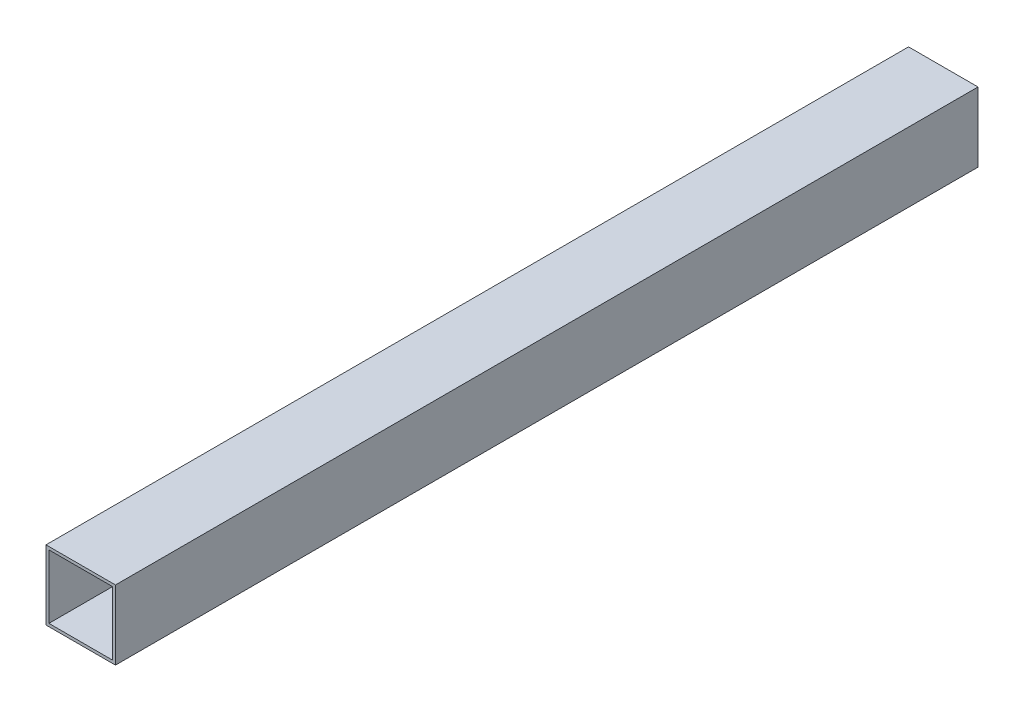
ISO-10303-21;
HEADER;
FILE_DESCRIPTION(('STEP AP214'),'2;1');
FILE_NAME('part.step','',(''),(''),'','','');
FILE_SCHEMA(('AUTOMOTIVE_DESIGN { 1 0 10303 214 1 1 1 1 }'));
ENDSEC;
DATA;
#1=APPLICATION_CONTEXT('core data for automotive mechanical design processes');
#2=APPLICATION_PROTOCOL_DEFINITION('international standard','automotive_design',2000,#1);
#3=PRODUCT_CONTEXT('',#1,'mechanical');
#4=PRODUCT('Part','Part','',(#3));
#5=PRODUCT_RELATED_PRODUCT_CATEGORY('part','',(#4));
#6=PRODUCT_DEFINITION_FORMATION('','',#4);
#7=PRODUCT_DEFINITION_CONTEXT('part definition',#1,'design');
#8=PRODUCT_DEFINITION('design','',#6,#7);
#9=PRODUCT_DEFINITION_SHAPE('','',#8);
#10=(LENGTH_UNIT() NAMED_UNIT(*) SI_UNIT(.MILLI.,.METRE.));
#11=(NAMED_UNIT(*) PLANE_ANGLE_UNIT() SI_UNIT($,.RADIAN.));
#12=(NAMED_UNIT(*) SI_UNIT($,.STERADIAN.) SOLID_ANGLE_UNIT());
#13=UNCERTAINTY_MEASURE_WITH_UNIT(LENGTH_MEASURE(1.E-05),#10,'distance_accuracy_value','');
#14=(GEOMETRIC_REPRESENTATION_CONTEXT(3) GLOBAL_UNCERTAINTY_ASSIGNED_CONTEXT((#13)) GLOBAL_UNIT_ASSIGNED_CONTEXT((#10,
#11,#12)) REPRESENTATION_CONTEXT('',''));
#15=CARTESIAN_POINT('',(0.,0.,0.));
#16=DIRECTION('',(0.,0.,1.));
#17=DIRECTION('',(1.,0.,0.));
#18=AXIS2_PLACEMENT_3D('',#15,#16,#17);
#19=CARTESIAN_POINT('',(0.,0.,946.15));
#20=DIRECTION('',(0.,0.,-1.));
#21=DIRECTION('',(-1.,0.,0.));
#22=AXIS2_PLACEMENT_3D('',#19,#20,#21);
#23=PLANE('',#22);
#24=DIRECTION('',(1.,0.,0.));
#25=VECTOR('',#24,1.);
#26=CARTESIAN_POINT('',(-40.7297095879192,18.6309754178664,946.15));
#27=LINE('',#26,#25);
#28=CARTESIAN_POINT('',(-40.7297095879192,18.6309754178664,946.15));
#29=VERTEX_POINT('',#28);
#30=CARTESIAN_POINT('',(35.4702904120808,18.6309754178664,946.15));
#31=VERTEX_POINT('',#30);
#32=EDGE_CURVE('E132',#29,#31,#27,.T.);
#33=ORIENTED_EDGE('',*,*,#32,.F.);
#34=DIRECTION('',(0.,-1.,0.));
#35=VECTOR('',#34,1.);
#36=CARTESIAN_POINT('',(-40.7297095879192,18.6309754178664,946.15));
#37=LINE('',#36,#35);
#38=CARTESIAN_POINT('',(-40.7297095879192,-57.5690245821336,946.15));
#39=VERTEX_POINT('',#38);
#40=EDGE_CURVE('E141',#29,#39,#37,.T.);
#41=ORIENTED_EDGE('',*,*,#40,.T.);
#42=DIRECTION('',(1.,0.,0.));
#43=VECTOR('',#42,1.);
#44=CARTESIAN_POINT('',(-40.7297095879192,-57.5690245821336,946.15));
#45=LINE('',#44,#43);
#46=CARTESIAN_POINT('',(35.4702904120808,-57.5690245821336,946.15));
#47=VERTEX_POINT('',#46);
#48=EDGE_CURVE('E139',#39,#47,#45,.T.);
#49=ORIENTED_EDGE('',*,*,#48,.T.);
#50=DIRECTION('',(0.,-1.,0.));
#51=VECTOR('',#50,1.);
#52=CARTESIAN_POINT('',(35.4702904120808,18.6309754178664,946.15));
#53=LINE('',#52,#51);
#54=EDGE_CURVE('E135',#31,#47,#53,.T.);
#55=ORIENTED_EDGE('',*,*,#54,.F.);
#56=EDGE_LOOP('',(#33,#41,#49,#55));
#57=FACE_BOUND('',#56,.T.);
#58=DIRECTION('',(1.,0.,0.));
#59=VECTOR('',#58,1.);
#60=CARTESIAN_POINT('',(-37.5547095879192,15.4559754178664,946.15));
#61=LINE('',#60,#59);
#62=CARTESIAN_POINT('',(-37.5547095879192,15.4559754178664,946.15));
#63=VERTEX_POINT('',#62);
#64=CARTESIAN_POINT('',(32.2952904120808,15.4559754178664,946.15));
#65=VERTEX_POINT('',#64);
#66=EDGE_CURVE('E56',#63,#65,#61,.T.);
#67=ORIENTED_EDGE('',*,*,#66,.T.);
#68=DIRECTION('',(0.,-1.,0.));
#69=VECTOR('',#68,1.);
#70=CARTESIAN_POINT('',(32.2952904120808,15.4559754178664,946.15));
#71=LINE('',#70,#69);
#72=CARTESIAN_POINT('',(32.2952904120808,-54.3940245821336,946.15));
#73=VERTEX_POINT('',#72);
#74=EDGE_CURVE('E114',#65,#73,#71,.T.);
#75=ORIENTED_EDGE('',*,*,#74,.T.);
#76=DIRECTION('',(1.,0.,0.));
#77=VECTOR('',#76,1.);
#78=CARTESIAN_POINT('',(-37.5547095879192,-54.3940245821336,946.15));
#79=LINE('',#78,#77);
#80=CARTESIAN_POINT('',(-37.5547095879192,-54.3940245821336,946.15));
#81=VERTEX_POINT('',#80);
#82=EDGE_CURVE('E120',#81,#73,#79,.T.);
#83=ORIENTED_EDGE('',*,*,#82,.F.);
#84=DIRECTION('',(0.,-1.,0.));
#85=VECTOR('',#84,1.);
#86=CARTESIAN_POINT('',(-37.5547095879192,15.4559754178664,946.15));
#87=LINE('',#86,#85);
#88=EDGE_CURVE('E123',#63,#81,#87,.T.);
#89=ORIENTED_EDGE('',*,*,#88,.F.);
#90=EDGE_LOOP('',(#67,#75,#83,#89));
#91=FACE_BOUND('',#90,.T.);
#92=ADVANCED_FACE('F41',(#57,#91),#23,.F.);
#93=CARTESIAN_POINT('',(0.,0.,0.));
#94=DIRECTION('',(0.,0.,-1.));
#95=DIRECTION('',(-1.,0.,0.));
#96=AXIS2_PLACEMENT_3D('',#93,#94,#95);
#97=PLANE('',#96);
#98=DIRECTION('',(1.,0.,0.));
#99=VECTOR('',#98,1.);
#100=CARTESIAN_POINT('',(-40.7297095879192,18.6309754178664,0.));
#101=LINE('',#100,#99);
#102=CARTESIAN_POINT('',(-40.7297095879192,18.6309754178664,0.));
#103=VERTEX_POINT('',#102);
#104=CARTESIAN_POINT('',(35.4702904120808,18.6309754178664,0.));
#105=VERTEX_POINT('',#104);
#106=EDGE_CURVE('E110',#103,#105,#101,.T.);
#107=ORIENTED_EDGE('',*,*,#106,.T.);
#108=DIRECTION('',(0.,-1.,0.));
#109=VECTOR('',#108,1.);
#110=CARTESIAN_POINT('',(35.4702904120808,18.6309754178664,0.));
#111=LINE('',#110,#109);
#112=CARTESIAN_POINT('',(35.4702904120808,-57.5690245821336,0.));
#113=VERTEX_POINT('',#112);
#114=EDGE_CURVE('E146',#105,#113,#111,.T.);
#115=ORIENTED_EDGE('',*,*,#114,.T.);
#116=DIRECTION('',(1.,0.,0.));
#117=VECTOR('',#116,1.);
#118=CARTESIAN_POINT('',(-40.7297095879192,-57.5690245821336,0.));
#119=LINE('',#118,#117);
#120=CARTESIAN_POINT('',(-40.7297095879192,-57.5690245821336,0.));
#121=VERTEX_POINT('',#120);
#122=EDGE_CURVE('E149',#121,#113,#119,.T.);
#123=ORIENTED_EDGE('',*,*,#122,.F.);
#124=DIRECTION('',(0.,-1.,0.));
#125=VECTOR('',#124,1.);
#126=CARTESIAN_POINT('',(-40.7297095879192,18.6309754178664,0.));
#127=LINE('',#126,#125);
#128=EDGE_CURVE('E136',#103,#121,#127,.T.);
#129=ORIENTED_EDGE('',*,*,#128,.F.);
#130=EDGE_LOOP('',(#107,#115,#123,#129));
#131=FACE_BOUND('',#130,.T.);
#132=DIRECTION('',(0.,1.,0.));
#133=VECTOR('',#132,1.);
#134=CARTESIAN_POINT('',(32.2952904120808,0.,0.));
#135=LINE('',#134,#133);
#136=CARTESIAN_POINT('',(32.2952904120808,-54.3940245821336,0.));
#137=VERTEX_POINT('',#136);
#138=CARTESIAN_POINT('',(32.2952904120808,15.4559754178664,0.));
#139=VERTEX_POINT('',#138);
#140=EDGE_CURVE('E49',#137,#139,#135,.T.);
#141=ORIENTED_EDGE('',*,*,#140,.T.);
#142=DIRECTION('',(-1.,0.,0.));
#143=VECTOR('',#142,1.);
#144=CARTESIAN_POINT('',(0.,15.4559754178664,0.));
#145=LINE('',#144,#143);
#146=CARTESIAN_POINT('',(-37.5547095879192,15.4559754178664,0.));
#147=VERTEX_POINT('',#146);
#148=EDGE_CURVE('E11',#139,#147,#145,.T.);
#149=ORIENTED_EDGE('',*,*,#148,.T.);
#150=DIRECTION('',(0.,1.,0.));
#151=VECTOR('',#150,1.);
#152=CARTESIAN_POINT('',(-37.5547095879192,0.,0.));
#153=LINE('',#152,#151);
#154=CARTESIAN_POINT('',(-37.5547095879192,-54.3940245821336,0.));
#155=VERTEX_POINT('',#154);
#156=EDGE_CURVE('E155',#155,#147,#153,.T.);
#157=ORIENTED_EDGE('',*,*,#156,.F.);
#158=DIRECTION('',(-1.,0.,0.));
#159=VECTOR('',#158,1.);
#160=CARTESIAN_POINT('',(0.,-54.3940245821336,0.));
#161=LINE('',#160,#159);
#162=EDGE_CURVE('E163',#137,#155,#161,.T.);
#163=ORIENTED_EDGE('',*,*,#162,.F.);
#164=EDGE_LOOP('',(#141,#149,#157,#163));
#165=FACE_BOUND('',#164,.T.);
#166=ADVANCED_FACE('F166',(#131,#165),#97,.T.);
#167=CARTESIAN_POINT('',(-40.7297095879192,18.6309754178664,946.15));
#168=DIRECTION('',(0.,1.,0.));
#169=DIRECTION('',(0.,0.,1.));
#170=AXIS2_PLACEMENT_3D('',#167,#168,#169);
#171=PLANE('',#170);
#172=ORIENTED_EDGE('',*,*,#106,.F.);
#173=DIRECTION('',(0.,0.,-1.));
#174=VECTOR('',#173,1.);
#175=CARTESIAN_POINT('',(-40.7297095879192,18.6309754178664,946.15));
#176=LINE('',#175,#174);
#177=EDGE_CURVE('E153',#29,#103,#176,.T.);
#178=ORIENTED_EDGE('',*,*,#177,.F.);
#179=ORIENTED_EDGE('',*,*,#32,.T.);
#180=DIRECTION('',(0.,0.,-1.));
#181=VECTOR('',#180,1.);
#182=CARTESIAN_POINT('',(35.4702904120808,18.6309754178664,946.15));
#183=LINE('',#182,#181);
#184=EDGE_CURVE('E143',#31,#105,#183,.T.);
#185=ORIENTED_EDGE('',*,*,#184,.T.);
#186=EDGE_LOOP('',(#172,#178,#179,#185));
#187=FACE_BOUND('',#186,.T.);
#188=ADVANCED_FACE('F43',(#187),#171,.T.);
#189=CARTESIAN_POINT('',(-40.7297095879192,18.6309754178664,946.15));
#190=DIRECTION('',(1.,0.,0.));
#191=DIRECTION('',(0.,0.,-1.));
#192=AXIS2_PLACEMENT_3D('',#189,#190,#191);
#193=PLANE('',#192);
#194=ORIENTED_EDGE('',*,*,#128,.T.);
#195=DIRECTION('',(0.,0.,-1.));
#196=VECTOR('',#195,1.);
#197=CARTESIAN_POINT('',(-40.7297095879192,-57.5690245821336,946.15));
#198=LINE('',#197,#196);
#199=EDGE_CURVE('E156',#39,#121,#198,.T.);
#200=ORIENTED_EDGE('',*,*,#199,.F.);
#201=ORIENTED_EDGE('',*,*,#40,.F.);
#202=ORIENTED_EDGE('',*,*,#177,.T.);
#203=EDGE_LOOP('',(#194,#200,#201,#202));
#204=FACE_BOUND('',#203,.T.);
#205=ADVANCED_FACE('F190',(#204),#193,.F.);
#206=CARTESIAN_POINT('',(-40.7297095879192,-57.5690245821336,946.15));
#207=DIRECTION('',(0.,1.,0.));
#208=DIRECTION('',(-1.,0.,0.));
#209=AXIS2_PLACEMENT_3D('',#206,#207,#208);
#210=PLANE('',#209);
#211=ORIENTED_EDGE('',*,*,#122,.T.);
#212=DIRECTION('',(0.,0.,-1.));
#213=VECTOR('',#212,1.);
#214=CARTESIAN_POINT('',(35.4702904120808,-57.5690245821336,946.15));
#215=LINE('',#214,#213);
#216=EDGE_CURVE('E159',#47,#113,#215,.T.);
#217=ORIENTED_EDGE('',*,*,#216,.F.);
#218=ORIENTED_EDGE('',*,*,#48,.F.);
#219=ORIENTED_EDGE('',*,*,#199,.T.);
#220=EDGE_LOOP('',(#211,#217,#218,#219));
#221=FACE_BOUND('',#220,.T.);
#222=ADVANCED_FACE('F193',(#221),#210,.F.);
#223=CARTESIAN_POINT('',(35.4702904120808,18.6309754178664,946.15));
#224=DIRECTION('',(1.,0.,0.));
#225=DIRECTION('',(0.,0.,-1.));
#226=AXIS2_PLACEMENT_3D('',#223,#224,#225);
#227=PLANE('',#226);
#228=ORIENTED_EDGE('',*,*,#114,.F.);
#229=ORIENTED_EDGE('',*,*,#184,.F.);
#230=ORIENTED_EDGE('',*,*,#54,.T.);
#231=ORIENTED_EDGE('',*,*,#216,.T.);
#232=EDGE_LOOP('',(#228,#229,#230,#231));
#233=FACE_BOUND('',#232,.T.);
#234=ADVANCED_FACE('F196',(#233),#227,.T.);
#235=CARTESIAN_POINT('',(-37.5547095879192,15.4559754178664,-152.4));
#236=DIRECTION('',(0.,-1.,0.));
#237=DIRECTION('',(0.,0.,-1.));
#238=AXIS2_PLACEMENT_3D('',#235,#236,#237);
#239=PLANE('',#238);
#240=DIRECTION('',(0.,0.,1.));
#241=VECTOR('',#240,1.);
#242=CARTESIAN_POINT('',(32.2952904120808,15.4559754178664,-152.4));
#243=LINE('',#242,#241);
#244=EDGE_CURVE('E105',#139,#65,#243,.T.);
#245=ORIENTED_EDGE('',*,*,#244,.T.);
#246=ORIENTED_EDGE('',*,*,#66,.F.);
#247=DIRECTION('',(0.,0.,1.));
#248=VECTOR('',#247,1.);
#249=CARTESIAN_POINT('',(-37.5547095879192,15.4559754178664,-152.4));
#250=LINE('',#249,#248);
#251=EDGE_CURVE('E128',#147,#63,#250,.T.);
#252=ORIENTED_EDGE('',*,*,#251,.F.);
#253=ORIENTED_EDGE('',*,*,#148,.F.);
#254=EDGE_LOOP('',(#245,#246,#252,#253));
#255=FACE_BOUND('',#254,.T.);
#256=ADVANCED_FACE('F107',(#255),#239,.T.);
#257=CARTESIAN_POINT('',(32.2952904120808,15.4559754178664,-152.4));
#258=DIRECTION('',(-1.,0.,0.));
#259=DIRECTION('',(0.,-1.,0.));
#260=AXIS2_PLACEMENT_3D('',#257,#258,#259);
#261=PLANE('',#260);
#262=DIRECTION('',(0.,0.,1.));
#263=VECTOR('',#262,1.);
#264=CARTESIAN_POINT('',(32.2952904120808,-54.3940245821336,-152.4));
#265=LINE('',#264,#263);
#266=EDGE_CURVE('E111',#137,#73,#265,.T.);
#267=ORIENTED_EDGE('',*,*,#266,.T.);
#268=ORIENTED_EDGE('',*,*,#74,.F.);
#269=ORIENTED_EDGE('',*,*,#244,.F.);
#270=ORIENTED_EDGE('',*,*,#140,.F.);
#271=EDGE_LOOP('',(#267,#268,#269,#270));
#272=FACE_BOUND('',#271,.T.);
#273=ADVANCED_FACE('F115',(#272),#261,.T.);
#274=CARTESIAN_POINT('',(-37.5547095879192,-54.3940245821336,-152.4));
#275=DIRECTION('',(0.,-1.,0.));
#276=DIRECTION('',(0.,0.,-1.));
#277=AXIS2_PLACEMENT_3D('',#274,#275,#276);
#278=PLANE('',#277);
#279=ORIENTED_EDGE('',*,*,#162,.T.);
#280=DIRECTION('',(0.,0.,1.));
#281=VECTOR('',#280,1.);
#282=CARTESIAN_POINT('',(-37.5547095879192,-54.3940245821336,-152.4));
#283=LINE('',#282,#281);
#284=EDGE_CURVE('E64',#155,#81,#283,.T.);
#285=ORIENTED_EDGE('',*,*,#284,.T.);
#286=ORIENTED_EDGE('',*,*,#82,.T.);
#287=ORIENTED_EDGE('',*,*,#266,.F.);
#288=EDGE_LOOP('',(#279,#285,#286,#287));
#289=FACE_BOUND('',#288,.T.);
#290=ADVANCED_FACE('F169',(#289),#278,.F.);
#291=CARTESIAN_POINT('',(-37.5547095879192,15.4559754178664,-152.4));
#292=DIRECTION('',(-1.,0.,0.));
#293=DIRECTION('',(0.,-1.,0.));
#294=AXIS2_PLACEMENT_3D('',#291,#292,#293);
#295=PLANE('',#294);
#296=ORIENTED_EDGE('',*,*,#156,.T.);
#297=ORIENTED_EDGE('',*,*,#251,.T.);
#298=ORIENTED_EDGE('',*,*,#88,.T.);
#299=ORIENTED_EDGE('',*,*,#284,.F.);
#300=EDGE_LOOP('',(#296,#297,#298,#299));
#301=FACE_BOUND('',#300,.T.);
#302=ADVANCED_FACE('F170',(#301),#295,.F.);
#303=CLOSED_SHELL('',(#92,#166,#188,#205,#222,#234,#256,#273,#290,#302));
#304=MANIFOLD_SOLID_BREP('B2',#303);
#305=ADVANCED_BREP_SHAPE_REPRESENTATION('',(#18,#304),#14);
#306=SHAPE_DEFINITION_REPRESENTATION(#9,#305);
ENDSEC;
END-ISO-10303-21;
